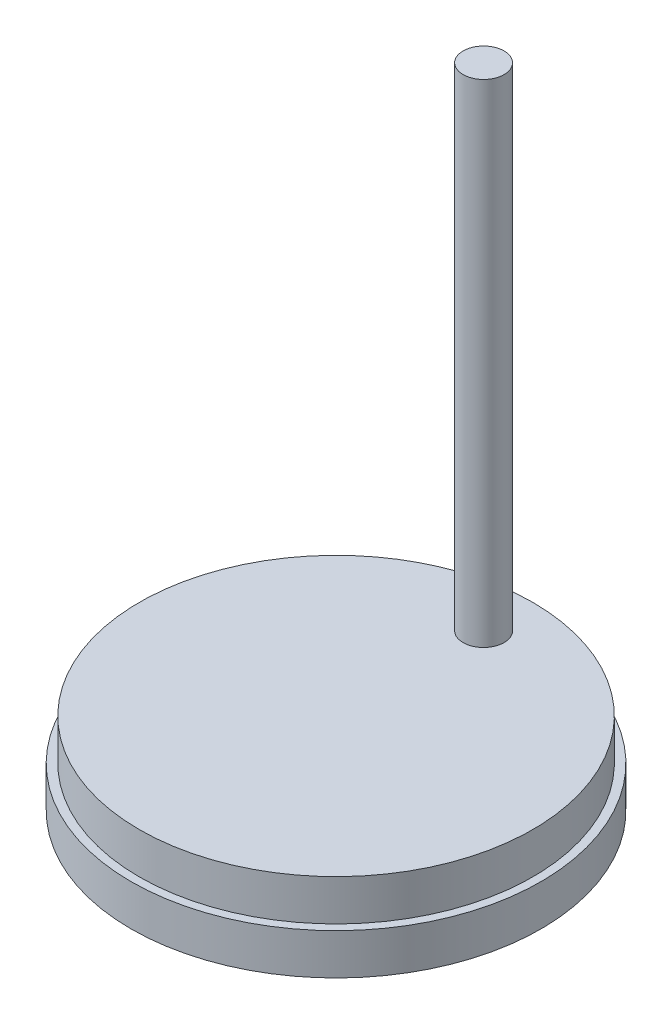
ISO-10303-21;
HEADER;
FILE_DESCRIPTION(('STEP AP214'),'2;1');
FILE_NAME('part.step','',(''),(''),'','','');
FILE_SCHEMA(('AUTOMOTIVE_DESIGN { 1 0 10303 214 1 1 1 1 }'));
ENDSEC;
DATA;
#1=APPLICATION_CONTEXT('core data for automotive mechanical design processes');
#2=APPLICATION_PROTOCOL_DEFINITION('international standard','automotive_design',2000,#1);
#3=PRODUCT_CONTEXT('',#1,'mechanical');
#4=PRODUCT('Part','Part','',(#3));
#5=PRODUCT_RELATED_PRODUCT_CATEGORY('part','',(#4));
#6=PRODUCT_DEFINITION_FORMATION('','',#4);
#7=PRODUCT_DEFINITION_CONTEXT('part definition',#1,'design');
#8=PRODUCT_DEFINITION('design','',#6,#7);
#9=PRODUCT_DEFINITION_SHAPE('','',#8);
#10=(LENGTH_UNIT() NAMED_UNIT(*) SI_UNIT(.MILLI.,.METRE.));
#11=(NAMED_UNIT(*) PLANE_ANGLE_UNIT() SI_UNIT($,.RADIAN.));
#12=(NAMED_UNIT(*) SI_UNIT($,.STERADIAN.) SOLID_ANGLE_UNIT());
#13=UNCERTAINTY_MEASURE_WITH_UNIT(LENGTH_MEASURE(1.E-05),#10,'distance_accuracy_value','');
#14=(GEOMETRIC_REPRESENTATION_CONTEXT(3) GLOBAL_UNCERTAINTY_ASSIGNED_CONTEXT((#13)) GLOBAL_UNIT_ASSIGNED_CONTEXT((#10,
#11,#12)) REPRESENTATION_CONTEXT('',''));
#15=CARTESIAN_POINT('',(0.,0.,0.));
#16=DIRECTION('',(0.,0.,1.));
#17=DIRECTION('',(1.,0.,0.));
#18=AXIS2_PLACEMENT_3D('',#15,#16,#17);
#19=CARTESIAN_POINT('',(0.,10.,0.));
#20=DIRECTION('',(0.,-1.,0.));
#21=DIRECTION('',(0.,0.,-1.));
#22=AXIS2_PLACEMENT_3D('',#19,#20,#21);
#23=CYLINDRICAL_SURFACE('',#22,50.);
#24=CARTESIAN_POINT('',(0.,10.,0.));
#25=DIRECTION('',(0.,1.,0.));
#26=DIRECTION('',(0.,0.,1.));
#27=AXIS2_PLACEMENT_3D('',#24,#25,#26);
#28=CIRCLE('',#27,50.);
#29=CARTESIAN_POINT('',(0.,10.,50.));
#30=VERTEX_POINT('',#29);
#31=EDGE_CURVE('E44',#30,#30,#28,.T.);
#32=ORIENTED_EDGE('',*,*,#31,.F.);
#33=EDGE_LOOP('',(#32));
#34=FACE_BOUND('',#33,.T.);
#35=CARTESIAN_POINT('',(0.,0.,0.));
#36=DIRECTION('',(0.,1.,0.));
#37=DIRECTION('',(0.,0.,1.));
#38=AXIS2_PLACEMENT_3D('',#35,#36,#37);
#39=CIRCLE('',#38,50.);
#40=CARTESIAN_POINT('',(0.,0.,50.));
#41=VERTEX_POINT('',#40);
#42=EDGE_CURVE('E40',#41,#41,#39,.T.);
#43=ORIENTED_EDGE('',*,*,#42,.T.);
#44=EDGE_LOOP('',(#43));
#45=FACE_BOUND('',#44,.T.);
#46=ADVANCED_FACE('F37',(#34,#45),#23,.T.);
#47=CARTESIAN_POINT('',(0.,10.,0.));
#48=DIRECTION('',(0.,1.,0.));
#49=DIRECTION('',(0.,0.,1.));
#50=AXIS2_PLACEMENT_3D('',#47,#48,#49);
#51=PLANE('',#50);
#52=CARTESIAN_POINT('',(0.,10.,0.));
#53=DIRECTION('',(0.,1.,0.));
#54=DIRECTION('',(0.,0.,1.));
#55=AXIS2_PLACEMENT_3D('',#52,#53,#54);
#56=CIRCLE('',#55,48.);
#57=CARTESIAN_POINT('',(0.,10.,48.));
#58=VERTEX_POINT('',#57);
#59=EDGE_CURVE('E10',#58,#58,#56,.T.);
#60=ORIENTED_EDGE('',*,*,#59,.F.);
#61=EDGE_LOOP('',(#60));
#62=FACE_BOUND('',#61,.T.);
#63=ORIENTED_EDGE('',*,*,#31,.T.);
#64=EDGE_LOOP('',(#63));
#65=FACE_BOUND('',#64,.T.);
#66=ADVANCED_FACE('F81',(#62,#65),#51,.T.);
#67=CARTESIAN_POINT('',(0.,0.,0.));
#68=DIRECTION('',(0.,1.,0.));
#69=DIRECTION('',(0.,0.,1.));
#70=AXIS2_PLACEMENT_3D('',#67,#68,#69);
#71=PLANE('',#70);
#72=ORIENTED_EDGE('',*,*,#42,.F.);
#73=EDGE_LOOP('',(#72));
#74=FACE_BOUND('',#73,.T.);
#75=ADVANCED_FACE('F76',(#74),#71,.F.);
#76=CARTESIAN_POINT('',(0.,20.,0.));
#77=DIRECTION('',(0.,-1.,0.));
#78=DIRECTION('',(0.,0.,-1.));
#79=AXIS2_PLACEMENT_3D('',#76,#77,#78);
#80=CYLINDRICAL_SURFACE('',#79,48.);
#81=CARTESIAN_POINT('',(0.,20.,0.));
#82=DIRECTION('',(0.,1.,0.));
#83=DIRECTION('',(0.,0.,1.));
#84=AXIS2_PLACEMENT_3D('',#81,#82,#83);
#85=CIRCLE('',#84,48.);
#86=CARTESIAN_POINT('',(0.,20.,48.));
#87=VERTEX_POINT('',#86);
#88=EDGE_CURVE('E50',#87,#87,#85,.T.);
#89=ORIENTED_EDGE('',*,*,#88,.F.);
#90=EDGE_LOOP('',(#89));
#91=FACE_BOUND('',#90,.T.);
#92=ORIENTED_EDGE('',*,*,#59,.T.);
#93=EDGE_LOOP('',(#92));
#94=FACE_BOUND('',#93,.T.);
#95=ADVANCED_FACE('F71',(#91,#94),#80,.T.);
#96=CARTESIAN_POINT('',(0.,20.,0.));
#97=DIRECTION('',(0.,1.,0.));
#98=DIRECTION('',(0.,0.,1.));
#99=AXIS2_PLACEMENT_3D('',#96,#97,#98);
#100=PLANE('',#99);
#101=CARTESIAN_POINT('',(0.,20.,-35.9894270733978));
#102=DIRECTION('',(0.,1.,0.));
#103=DIRECTION('',(0.,0.,1.));
#104=AXIS2_PLACEMENT_3D('',#101,#102,#103);
#105=CIRCLE('',#104,5.);
#106=CARTESIAN_POINT('',(0.,20.,-30.9894270733978));
#107=VERTEX_POINT('',#106);
#108=EDGE_CURVE('E54',#107,#107,#105,.T.);
#109=ORIENTED_EDGE('',*,*,#108,.F.);
#110=EDGE_LOOP('',(#109));
#111=FACE_BOUND('',#110,.T.);
#112=ORIENTED_EDGE('',*,*,#88,.T.);
#113=EDGE_LOOP('',(#112));
#114=FACE_BOUND('',#113,.T.);
#115=ADVANCED_FACE('F65',(#111,#114),#100,.T.);
#116=CARTESIAN_POINT('',(0.,140.,-35.9894270733978));
#117=DIRECTION('',(0.,-1.,0.));
#118=DIRECTION('',(0.,0.,-1.));
#119=AXIS2_PLACEMENT_3D('',#116,#117,#118);
#120=CYLINDRICAL_SURFACE('',#119,5.);
#121=CARTESIAN_POINT('',(0.,140.,-35.9894270733978));
#122=DIRECTION('',(0.,1.,0.));
#123=DIRECTION('',(0.,0.,1.));
#124=AXIS2_PLACEMENT_3D('',#121,#122,#123);
#125=CIRCLE('',#124,5.);
#126=CARTESIAN_POINT('',(0.,140.,-30.9894270733978));
#127=VERTEX_POINT('',#126);
#128=EDGE_CURVE('E53',#127,#127,#125,.T.);
#129=ORIENTED_EDGE('',*,*,#128,.F.);
#130=EDGE_LOOP('',(#129));
#131=FACE_BOUND('',#130,.T.);
#132=ORIENTED_EDGE('',*,*,#108,.T.);
#133=EDGE_LOOP('',(#132));
#134=FACE_BOUND('',#133,.T.);
#135=ADVANCED_FACE('F62',(#131,#134),#120,.T.);
#136=CARTESIAN_POINT('',(0.,140.,-35.9894270733978));
#137=DIRECTION('',(0.,1.,0.));
#138=DIRECTION('',(0.,0.,1.));
#139=AXIS2_PLACEMENT_3D('',#136,#137,#138);
#140=PLANE('',#139);
#141=ORIENTED_EDGE('',*,*,#128,.T.);
#142=EDGE_LOOP('',(#141));
#143=FACE_BOUND('',#142,.T.);
#144=ADVANCED_FACE('F60',(#143),#140,.T.);
#145=CLOSED_SHELL('',(#46,#66,#75,#95,#115,#135,#144));
#146=MANIFOLD_SOLID_BREP('B2',#145);
#147=ADVANCED_BREP_SHAPE_REPRESENTATION('',(#18,#146),#14);
#148=SHAPE_DEFINITION_REPRESENTATION(#9,#147);
ENDSEC;
END-ISO-10303-21;
